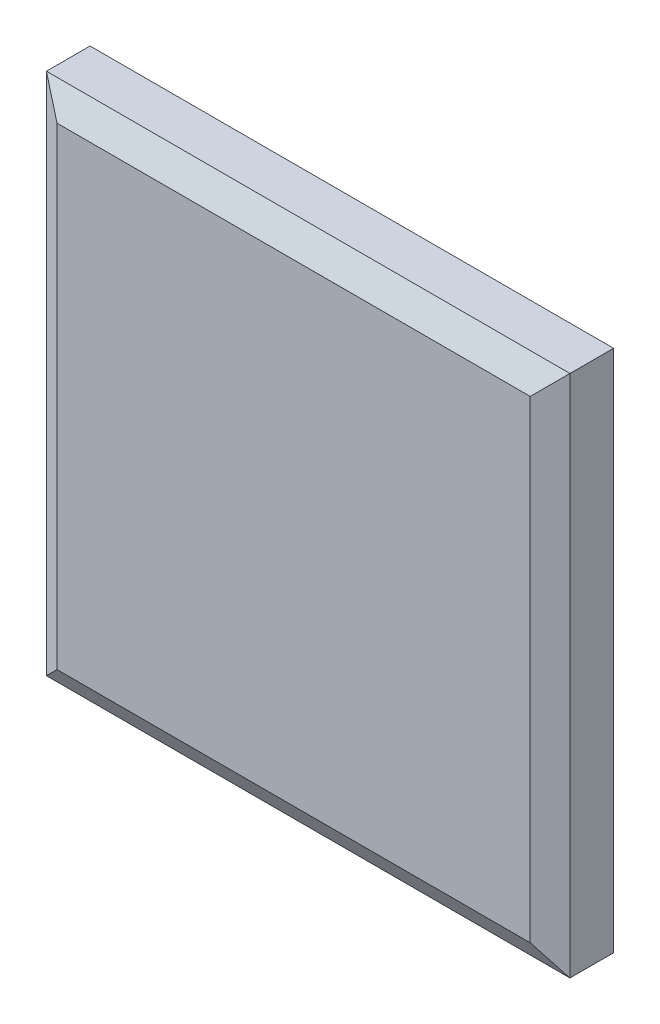
ISO-10303-21;
HEADER;
FILE_DESCRIPTION(('STEP AP214'),'2;1');
FILE_NAME('part.step','',(''),(''),'','','');
FILE_SCHEMA(('AUTOMOTIVE_DESIGN { 1 0 10303 214 1 1 1 1 }'));
ENDSEC;
DATA;
#1=APPLICATION_CONTEXT('core data for automotive mechanical design processes');
#2=APPLICATION_PROTOCOL_DEFINITION('international standard','automotive_design',2000,#1);
#3=PRODUCT_CONTEXT('',#1,'mechanical');
#4=PRODUCT('Part','Part','',(#3));
#5=PRODUCT_RELATED_PRODUCT_CATEGORY('part','',(#4));
#6=PRODUCT_DEFINITION_FORMATION('','',#4);
#7=PRODUCT_DEFINITION_CONTEXT('part definition',#1,'design');
#8=PRODUCT_DEFINITION('design','',#6,#7);
#9=PRODUCT_DEFINITION_SHAPE('','',#8);
#10=(LENGTH_UNIT() NAMED_UNIT(*) SI_UNIT(.MILLI.,.METRE.));
#11=(NAMED_UNIT(*) PLANE_ANGLE_UNIT() SI_UNIT($,.RADIAN.));
#12=(NAMED_UNIT(*) SI_UNIT($,.STERADIAN.) SOLID_ANGLE_UNIT());
#13=UNCERTAINTY_MEASURE_WITH_UNIT(LENGTH_MEASURE(1.E-05),#10,'distance_accuracy_value','');
#14=(GEOMETRIC_REPRESENTATION_CONTEXT(3) GLOBAL_UNCERTAINTY_ASSIGNED_CONTEXT((#13)) GLOBAL_UNIT_ASSIGNED_CONTEXT((#10,
#11,#12)) REPRESENTATION_CONTEXT('',''));
#15=CARTESIAN_POINT('',(0.,0.,0.));
#16=DIRECTION('',(0.,0.,1.));
#17=DIRECTION('',(1.,0.,0.));
#18=AXIS2_PLACEMENT_3D('',#15,#16,#17);
#19=CARTESIAN_POINT('',(0.,-3.,0.));
#20=DIRECTION('',(0.,-0.499999999999999,0.866025403784439));
#21=DIRECTION('',(0.,-0.866025403784439,-0.499999999999999));
#22=AXIS2_PLACEMENT_3D('',#19,#20,#21);
#23=PLANE('',#22);
#24=DIRECTION('',(-1.,0.,0.));
#25=VECTOR('',#24,1.);
#26=CARTESIAN_POINT('',(0.,-3.,0.));
#27=LINE('',#26,#25);
#28=CARTESIAN_POINT('',(18.,-3.,0.));
#29=VERTEX_POINT('',#28);
#30=CARTESIAN_POINT('',(16.,-3.,0.));
#31=VERTEX_POINT('',#30);
#32=EDGE_CURVE('E59',#29,#31,#27,.T.);
#33=ORIENTED_EDGE('',*,*,#32,.F.);
#34=DIRECTION('',(0.654653670707977,-0.654653670707977,-0.377964473009226));
#35=VECTOR('',#34,1.);
#36=CARTESIAN_POINT('',(16.7142857142857,-1.71428571428571,0.74230748895809));
#37=LINE('',#36,#35);
#38=CARTESIAN_POINT('',(16.2679491924311,-1.26794919243112,1.));
#39=VERTEX_POINT('',#38);
#40=EDGE_CURVE('E11',#39,#29,#37,.T.);
#41=ORIENTED_EDGE('',*,*,#40,.F.);
#42=DIRECTION('',(-1.,0.,0.));
#43=VECTOR('',#42,1.);
#44=CARTESIAN_POINT('',(0.,-1.26794919243112,1.));
#45=LINE('',#44,#43);
#46=CARTESIAN_POINT('',(-16.2679491924311,-1.26794919243112,1.));
#47=VERTEX_POINT('',#46);
#48=EDGE_CURVE('E365',#39,#47,#45,.T.);
#49=ORIENTED_EDGE('',*,*,#48,.T.);
#50=DIRECTION('',(-0.654653670707977,-0.654653670707977,-0.377964473009226));
#51=VECTOR('',#50,1.);
#52=CARTESIAN_POINT('',(-10.2857142857143,4.71428571428572,4.45384493374854));
#53=LINE('',#52,#51);
#54=CARTESIAN_POINT('',(-18.,-3.,0.));
#55=VERTEX_POINT('',#54);
#56=EDGE_CURVE('E67',#47,#55,#53,.T.);
#57=ORIENTED_EDGE('',*,*,#56,.T.);
#58=DIRECTION('',(-1.,0.,0.));
#59=VECTOR('',#58,1.);
#60=CARTESIAN_POINT('',(0.,-3.,0.));
#61=LINE('',#60,#59);
#62=CARTESIAN_POINT('',(-16.,-3.,0.));
#63=VERTEX_POINT('',#62);
#64=EDGE_CURVE('E291',#63,#55,#61,.T.);
#65=ORIENTED_EDGE('',*,*,#64,.F.);
#66=EDGE_CURVE('E331',#31,#63,#27,.T.);
#67=ORIENTED_EDGE('',*,*,#66,.F.);
#68=EDGE_LOOP('',(#33,#41,#49,#57,#65,#67));
#69=FACE_BOUND('',#68,.T.);
#70=ADVANCED_FACE('F41',(#69),#23,.T.);
#71=CARTESIAN_POINT('',(18.,0.,0.));
#72=DIRECTION('',(0.499999999999999,0.,0.866025403784439));
#73=DIRECTION('',(0.866025403784439,0.,-0.499999999999999));
#74=AXIS2_PLACEMENT_3D('',#71,#72,#73);
#75=PLANE('',#74);
#76=DIRECTION('',(0.,-1.,0.));
#77=VECTOR('',#76,1.);
#78=CARTESIAN_POINT('',(18.,0.,0.));
#79=LINE('',#78,#77);
#80=CARTESIAN_POINT('',(18.,33.,0.));
#81=VERTEX_POINT('',#80);
#82=EDGE_CURVE('E356',#81,#29,#79,.T.);
#83=ORIENTED_EDGE('',*,*,#82,.F.);
#84=DIRECTION('',(0.654653670707977,0.654653670707977,-0.377964473009227));
#85=VECTOR('',#84,1.);
#86=CARTESIAN_POINT('',(10.2857142857143,25.2857142857143,4.45384493374853));
#87=LINE('',#86,#85);
#88=CARTESIAN_POINT('',(16.2679491924311,31.2679491924311,1.));
#89=VERTEX_POINT('',#88);
#90=EDGE_CURVE('E51',#89,#81,#87,.T.);
#91=ORIENTED_EDGE('',*,*,#90,.F.);
#92=DIRECTION('',(0.,-1.,0.));
#93=VECTOR('',#92,1.);
#94=CARTESIAN_POINT('',(16.2679491924311,0.,1.));
#95=LINE('',#94,#93);
#96=EDGE_CURVE('E378',#89,#39,#95,.T.);
#97=ORIENTED_EDGE('',*,*,#96,.T.);
#98=ORIENTED_EDGE('',*,*,#40,.T.);
#99=EDGE_LOOP('',(#83,#91,#97,#98));
#100=FACE_BOUND('',#99,.T.);
#101=ADVANCED_FACE('F43',(#100),#75,.T.);
#102=CARTESIAN_POINT('',(0.,33.,0.));
#103=DIRECTION('',(0.,0.499999999999999,0.866025403784439));
#104=DIRECTION('',(0.,-0.866025403784439,0.499999999999999));
#105=AXIS2_PLACEMENT_3D('',#102,#103,#104);
#106=PLANE('',#105);
#107=DIRECTION('',(1.,0.,0.));
#108=VECTOR('',#107,1.);
#109=CARTESIAN_POINT('',(0.,33.,0.));
#110=LINE('',#109,#108);
#111=CARTESIAN_POINT('',(-18.,33.,0.));
#112=VERTEX_POINT('',#111);
#113=EDGE_CURVE('E359',#112,#81,#110,.T.);
#114=ORIENTED_EDGE('',*,*,#113,.F.);
#115=DIRECTION('',(-0.654653670707977,0.654653670707977,-0.377964473009226));
#116=VECTOR('',#115,1.);
#117=CARTESIAN_POINT('',(-3.85714285714285,18.8571428571429,8.16538237853898));
#118=LINE('',#117,#116);
#119=CARTESIAN_POINT('',(-16.2679491924311,31.2679491924311,1.));
#120=VERTEX_POINT('',#119);
#121=EDGE_CURVE('E369',#120,#112,#118,.T.);
#122=ORIENTED_EDGE('',*,*,#121,.F.);
#123=DIRECTION('',(1.,0.,0.));
#124=VECTOR('',#123,1.);
#125=CARTESIAN_POINT('',(0.,31.2679491924311,1.));
#126=LINE('',#125,#124);
#127=EDGE_CURVE('E381',#120,#89,#126,.T.);
#128=ORIENTED_EDGE('',*,*,#127,.T.);
#129=ORIENTED_EDGE('',*,*,#90,.T.);
#130=EDGE_LOOP('',(#114,#122,#128,#129));
#131=FACE_BOUND('',#130,.T.);
#132=ADVANCED_FACE('F396',(#131),#106,.T.);
#133=CARTESIAN_POINT('',(-18.,0.,0.));
#134=DIRECTION('',(-0.499999999999999,0.,0.866025403784439));
#135=DIRECTION('',(0.866025403784439,0.,0.499999999999999));
#136=AXIS2_PLACEMENT_3D('',#133,#134,#135);
#137=PLANE('',#136);
#138=DIRECTION('',(0.,1.,0.));
#139=VECTOR('',#138,1.);
#140=CARTESIAN_POINT('',(-18.,0.,0.));
#141=LINE('',#140,#139);
#142=EDGE_CURVE('E362',#55,#112,#141,.T.);
#143=ORIENTED_EDGE('',*,*,#142,.F.);
#144=ORIENTED_EDGE('',*,*,#56,.F.);
#145=DIRECTION('',(0.,1.,0.));
#146=VECTOR('',#145,1.);
#147=CARTESIAN_POINT('',(-16.2679491924311,0.,1.));
#148=LINE('',#147,#146);
#149=EDGE_CURVE('E45',#47,#120,#148,.T.);
#150=ORIENTED_EDGE('',*,*,#149,.T.);
#151=ORIENTED_EDGE('',*,*,#121,.T.);
#152=EDGE_LOOP('',(#143,#144,#150,#151));
#153=FACE_BOUND('',#152,.T.);
#154=ADVANCED_FACE('F388',(#153),#137,.T.);
#155=CARTESIAN_POINT('',(0.,0.,1.));
#156=DIRECTION('',(0.,0.,1.));
#157=DIRECTION('',(1.,0.,0.));
#158=AXIS2_PLACEMENT_3D('',#155,#156,#157);
#159=PLANE('',#158);
#160=ORIENTED_EDGE('',*,*,#48,.F.);
#161=ORIENTED_EDGE('',*,*,#96,.F.);
#162=ORIENTED_EDGE('',*,*,#127,.F.);
#163=ORIENTED_EDGE('',*,*,#149,.F.);
#164=EDGE_LOOP('',(#160,#161,#162,#163));
#165=FACE_BOUND('',#164,.T.);
#166=ADVANCED_FACE('F392',(#165),#159,.T.);
#167=CARTESIAN_POINT('',(0.,0.,0.));
#168=DIRECTION('',(0.,0.,1.));
#169=DIRECTION('',(1.,0.,0.));
#170=AXIS2_PLACEMENT_3D('',#167,#168,#169);
#171=PLANE('',#170);
#172=ORIENTED_EDGE('',*,*,#66,.T.);
#173=DIRECTION('',(0.,1.,0.));
#174=VECTOR('',#173,1.);
#175=CARTESIAN_POINT('',(-16.,0.,0.));
#176=LINE('',#175,#174);
#177=CARTESIAN_POINT('',(-16.,31.,0.));
#178=VERTEX_POINT('',#177);
#179=EDGE_CURVE('E317',#63,#178,#176,.T.);
#180=ORIENTED_EDGE('',*,*,#179,.T.);
#181=DIRECTION('',(1.,0.,0.));
#182=VECTOR('',#181,1.);
#183=CARTESIAN_POINT('',(0.,31.,0.));
#184=LINE('',#183,#182);
#185=CARTESIAN_POINT('',(16.,31.,0.));
#186=VERTEX_POINT('',#185);
#187=EDGE_CURVE('E321',#178,#186,#184,.T.);
#188=ORIENTED_EDGE('',*,*,#187,.T.);
#189=DIRECTION('',(0.,-1.,0.));
#190=VECTOR('',#189,1.);
#191=CARTESIAN_POINT('',(16.,0.,0.));
#192=LINE('',#191,#190);
#193=EDGE_CURVE('E296',#186,#31,#192,.T.);
#194=ORIENTED_EDGE('',*,*,#193,.T.);
#195=EDGE_LOOP('',(#172,#180,#188,#194));
#196=FACE_BOUND('',#195,.T.);
#197=ADVANCED_FACE('F455',(#196),#171,.F.);
#198=CARTESIAN_POINT('',(-18.,0.,-3.));
#199=DIRECTION('',(1.,0.,0.));
#200=DIRECTION('',(0.,0.,-1.));
#201=AXIS2_PLACEMENT_3D('',#198,#199,#200);
#202=PLANE('',#201);
#203=ORIENTED_EDGE('',*,*,#142,.T.);
#204=DIRECTION('',(0.,0.,1.));
#205=VECTOR('',#204,1.);
#206=CARTESIAN_POINT('',(-18.,33.,-3.));
#207=LINE('',#206,#205);
#208=CARTESIAN_POINT('',(-18.,33.,-3.));
#209=VERTEX_POINT('',#208);
#210=EDGE_CURVE('E328',#209,#112,#207,.T.);
#211=ORIENTED_EDGE('',*,*,#210,.F.);
#212=DIRECTION('',(0.,1.,0.));
#213=VECTOR('',#212,1.);
#214=CARTESIAN_POINT('',(-18.,0.,-3.));
#215=LINE('',#214,#213);
#216=CARTESIAN_POINT('',(-18.,-3.,-3.));
#217=VERTEX_POINT('',#216);
#218=EDGE_CURVE('E292',#217,#209,#215,.T.);
#219=ORIENTED_EDGE('',*,*,#218,.F.);
#220=DIRECTION('',(0.,0.,1.));
#221=VECTOR('',#220,1.);
#222=CARTESIAN_POINT('',(-18.,-3.,-3.));
#223=LINE('',#222,#221);
#224=EDGE_CURVE('E314',#217,#55,#223,.T.);
#225=ORIENTED_EDGE('',*,*,#224,.T.);
#226=EDGE_LOOP('',(#203,#211,#219,#225));
#227=FACE_BOUND('',#226,.T.);
#228=ADVANCED_FACE('F453',(#227),#202,.F.);
#229=CARTESIAN_POINT('',(0.,33.,-3.));
#230=DIRECTION('',(0.,-1.,0.));
#231=DIRECTION('',(0.,0.,-1.));
#232=AXIS2_PLACEMENT_3D('',#229,#230,#231);
#233=PLANE('',#232);
#234=ORIENTED_EDGE('',*,*,#113,.T.);
#235=DIRECTION('',(0.,0.,1.));
#236=VECTOR('',#235,1.);
#237=CARTESIAN_POINT('',(18.,33.,-3.));
#238=LINE('',#237,#236);
#239=CARTESIAN_POINT('',(18.,33.,-3.));
#240=VERTEX_POINT('',#239);
#241=EDGE_CURVE('E332',#240,#81,#238,.T.);
#242=ORIENTED_EDGE('',*,*,#241,.F.);
#243=DIRECTION('',(1.,0.,0.));
#244=VECTOR('',#243,1.);
#245=CARTESIAN_POINT('',(0.,33.,-3.));
#246=LINE('',#245,#244);
#247=EDGE_CURVE('E311',#209,#240,#246,.T.);
#248=ORIENTED_EDGE('',*,*,#247,.F.);
#249=ORIENTED_EDGE('',*,*,#210,.T.);
#250=EDGE_LOOP('',(#234,#242,#248,#249));
#251=FACE_BOUND('',#250,.T.);
#252=ADVANCED_FACE('F399',(#251),#233,.F.);
#253=CARTESIAN_POINT('',(18.,0.,-3.));
#254=DIRECTION('',(-1.,0.,0.));
#255=DIRECTION('',(0.,-1.,0.));
#256=AXIS2_PLACEMENT_3D('',#253,#254,#255);
#257=PLANE('',#256);
#258=ORIENTED_EDGE('',*,*,#82,.T.);
#259=DIRECTION('',(0.,0.,1.));
#260=VECTOR('',#259,1.);
#261=CARTESIAN_POINT('',(18.,-3.,-3.));
#262=LINE('',#261,#260);
#263=CARTESIAN_POINT('',(18.,-3.,-3.));
#264=VERTEX_POINT('',#263);
#265=EDGE_CURVE('E336',#264,#29,#262,.T.);
#266=ORIENTED_EDGE('',*,*,#265,.F.);
#267=DIRECTION('',(0.,-1.,0.));
#268=VECTOR('',#267,1.);
#269=CARTESIAN_POINT('',(18.,0.,-3.));
#270=LINE('',#269,#268);
#271=EDGE_CURVE('E308',#240,#264,#270,.T.);
#272=ORIENTED_EDGE('',*,*,#271,.F.);
#273=ORIENTED_EDGE('',*,*,#241,.T.);
#274=EDGE_LOOP('',(#258,#266,#272,#273));
#275=FACE_BOUND('',#274,.T.);
#276=ADVANCED_FACE('F404',(#275),#257,.F.);
#277=CARTESIAN_POINT('',(0.,-3.,-3.));
#278=DIRECTION('',(0.,1.,0.));
#279=DIRECTION('',(-1.,0.,0.));
#280=AXIS2_PLACEMENT_3D('',#277,#278,#279);
#281=PLANE('',#280);
#282=ORIENTED_EDGE('',*,*,#32,.T.);
#283=DIRECTION('',(0.,0.,1.));
#284=VECTOR('',#283,1.);
#285=CARTESIAN_POINT('',(16.,-3.,-3.));
#286=LINE('',#285,#284);
#287=CARTESIAN_POINT('',(16.,-3.,-3.));
#288=VERTEX_POINT('',#287);
#289=EDGE_CURVE('E339',#288,#31,#286,.T.);
#290=ORIENTED_EDGE('',*,*,#289,.F.);
#291=DIRECTION('',(-1.,0.,0.));
#292=VECTOR('',#291,1.);
#293=CARTESIAN_POINT('',(0.,-3.,-3.));
#294=LINE('',#293,#292);
#295=EDGE_CURVE('E300',#264,#288,#294,.T.);
#296=ORIENTED_EDGE('',*,*,#295,.F.);
#297=ORIENTED_EDGE('',*,*,#265,.T.);
#298=EDGE_LOOP('',(#282,#290,#296,#297));
#299=FACE_BOUND('',#298,.T.);
#300=ADVANCED_FACE('F513',(#299),#281,.F.);
#301=CARTESIAN_POINT('',(16.,0.,-3.));
#302=DIRECTION('',(-1.,0.,0.));
#303=DIRECTION('',(0.,0.,1.));
#304=AXIS2_PLACEMENT_3D('',#301,#302,#303);
#305=PLANE('',#304);
#306=ORIENTED_EDGE('',*,*,#193,.F.);
#307=DIRECTION('',(0.,0.,1.));
#308=VECTOR('',#307,1.);
#309=CARTESIAN_POINT('',(16.,31.,-3.));
#310=LINE('',#309,#308);
#311=CARTESIAN_POINT('',(16.,31.,-3.));
#312=VERTEX_POINT('',#311);
#313=EDGE_CURVE('E342',#312,#186,#310,.T.);
#314=ORIENTED_EDGE('',*,*,#313,.F.);
#315=DIRECTION('',(0.,-1.,0.));
#316=VECTOR('',#315,1.);
#317=CARTESIAN_POINT('',(16.,0.,-3.));
#318=LINE('',#317,#316);
#319=CARTESIAN_POINT('',(16.,11.,-3.));
#320=VERTEX_POINT('',#319);
#321=EDGE_CURVE('E185',#312,#320,#318,.T.);
#322=ORIENTED_EDGE('',*,*,#321,.T.);
#323=DIRECTION('',(0.,1.,0.));
#324=VECTOR('',#323,1.);
#325=CARTESIAN_POINT('',(16.,0.,-3.));
#326=LINE('',#325,#324);
#327=CARTESIAN_POINT('',(16.,4.,-3.));
#328=VERTEX_POINT('',#327);
#329=EDGE_CURVE('E195',#328,#320,#326,.T.);
#330=ORIENTED_EDGE('',*,*,#329,.F.);
#331=EDGE_CURVE('E173',#328,#288,#318,.T.);
#332=ORIENTED_EDGE('',*,*,#331,.T.);
#333=ORIENTED_EDGE('',*,*,#289,.T.);
#334=EDGE_LOOP('',(#306,#314,#322,#330,#332,#333));
#335=FACE_BOUND('',#334,.T.);
#336=ADVANCED_FACE('F212',(#335),#305,.T.);
#337=CARTESIAN_POINT('',(0.,31.,-3.));
#338=DIRECTION('',(0.,-1.,0.));
#339=DIRECTION('',(0.,0.,-1.));
#340=AXIS2_PLACEMENT_3D('',#337,#338,#339);
#341=PLANE('',#340);
#342=ORIENTED_EDGE('',*,*,#187,.F.);
#343=DIRECTION('',(0.,0.,1.));
#344=VECTOR('',#343,1.);
#345=CARTESIAN_POINT('',(-16.,31.,-3.));
#346=LINE('',#345,#344);
#347=CARTESIAN_POINT('',(-16.,31.,-3.));
#348=VERTEX_POINT('',#347);
#349=EDGE_CURVE('E345',#348,#178,#346,.T.);
#350=ORIENTED_EDGE('',*,*,#349,.F.);
#351=DIRECTION('',(1.,0.,0.));
#352=VECTOR('',#351,1.);
#353=CARTESIAN_POINT('',(0.,31.,-3.));
#354=LINE('',#353,#352);
#355=EDGE_CURVE('E186',#348,#312,#354,.T.);
#356=ORIENTED_EDGE('',*,*,#355,.T.);
#357=ORIENTED_EDGE('',*,*,#313,.T.);
#358=EDGE_LOOP('',(#342,#350,#356,#357));
#359=FACE_BOUND('',#358,.T.);
#360=ADVANCED_FACE('F530',(#359),#341,.T.);
#361=CARTESIAN_POINT('',(-16.,0.,-3.));
#362=DIRECTION('',(1.,0.,0.));
#363=DIRECTION('',(0.,0.,-1.));
#364=AXIS2_PLACEMENT_3D('',#361,#362,#363);
#365=PLANE('',#364);
#366=ORIENTED_EDGE('',*,*,#179,.F.);
#367=DIRECTION('',(0.,0.,1.));
#368=VECTOR('',#367,1.);
#369=CARTESIAN_POINT('',(-16.,-3.,-3.));
#370=LINE('',#369,#368);
#371=CARTESIAN_POINT('',(-16.,-3.,-3.));
#372=VERTEX_POINT('',#371);
#373=EDGE_CURVE('E348',#372,#63,#370,.T.);
#374=ORIENTED_EDGE('',*,*,#373,.F.);
#375=DIRECTION('',(0.,1.,0.));
#376=VECTOR('',#375,1.);
#377=CARTESIAN_POINT('',(-16.,0.,-3.));
#378=LINE('',#377,#376);
#379=CARTESIAN_POINT('',(-16.,4.,-3.));
#380=VERTEX_POINT('',#379);
#381=EDGE_CURVE('E301',#372,#380,#378,.T.);
#382=ORIENTED_EDGE('',*,*,#381,.T.);
#383=DIRECTION('',(0.,-1.,0.));
#384=VECTOR('',#383,1.);
#385=CARTESIAN_POINT('',(-16.,0.,-3.));
#386=LINE('',#385,#384);
#387=CARTESIAN_POINT('',(-16.,11.,-3.));
#388=VERTEX_POINT('',#387);
#389=EDGE_CURVE('E218',#388,#380,#386,.T.);
#390=ORIENTED_EDGE('',*,*,#389,.F.);
#391=EDGE_CURVE('E299',#388,#348,#378,.T.);
#392=ORIENTED_EDGE('',*,*,#391,.T.);
#393=ORIENTED_EDGE('',*,*,#349,.T.);
#394=EDGE_LOOP('',(#366,#374,#382,#390,#392,#393));
#395=FACE_BOUND('',#394,.T.);
#396=ADVANCED_FACE('F444',(#395),#365,.T.);
#397=ORIENTED_EDGE('',*,*,#64,.T.);
#398=ORIENTED_EDGE('',*,*,#224,.F.);
#399=EDGE_CURVE('E295',#372,#217,#294,.T.);
#400=ORIENTED_EDGE('',*,*,#399,.F.);
#401=ORIENTED_EDGE('',*,*,#373,.T.);
#402=EDGE_LOOP('',(#397,#398,#400,#401));
#403=FACE_BOUND('',#402,.T.);
#404=ADVANCED_FACE('F450',(#403),#281,.F.);
#405=CARTESIAN_POINT('',(0.,0.,-3.));
#406=DIRECTION('',(0.,0.,-1.));
#407=DIRECTION('',(-1.,0.,0.));
#408=AXIS2_PLACEMENT_3D('',#405,#406,#407);
#409=PLANE('',#408);
#410=ORIENTED_EDGE('',*,*,#331,.F.);
#411=DIRECTION('',(1.,0.,0.));
#412=VECTOR('',#411,1.);
#413=CARTESIAN_POINT('',(0.,4.,-3.));
#414=LINE('',#413,#412);
#415=EDGE_CURVE('E177',#380,#328,#414,.T.);
#416=ORIENTED_EDGE('',*,*,#415,.F.);
#417=ORIENTED_EDGE('',*,*,#381,.F.);
#418=DIRECTION('',(-1.,0.,0.));
#419=VECTOR('',#418,1.);
#420=CARTESIAN_POINT('',(0.,-3.,-3.));
#421=LINE('',#420,#419);
#422=EDGE_CURVE('E180',#288,#372,#421,.T.);
#423=ORIENTED_EDGE('',*,*,#422,.F.);
#424=EDGE_LOOP('',(#410,#416,#417,#423));
#425=FACE_BOUND('',#424,.T.);
#426=ADVANCED_FACE('F175',(#425),#409,.F.);
#427=CARTESIAN_POINT('',(0.,0.,-4.));
#428=DIRECTION('',(0.,0.,-1.));
#429=DIRECTION('',(-1.,0.,0.));
#430=AXIS2_PLACEMENT_3D('',#427,#428,#429);
#431=PLANE('',#430);
#432=DIRECTION('',(0.,-1.,0.));
#433=VECTOR('',#432,1.);
#434=CARTESIAN_POINT('',(-16.2679491924311,0.,-4.));
#435=LINE('',#434,#433);
#436=CARTESIAN_POINT('',(-16.2679491924311,-1.26794919243112,-4.));
#437=VERTEX_POINT('',#436);
#438=CARTESIAN_POINT('',(-16.2679491924311,2.26794919243112,-4.));
#439=VERTEX_POINT('',#438);
#440=EDGE_CURVE('E263',#437,#439,#435,.F.);
#441=ORIENTED_EDGE('',*,*,#440,.T.);
#442=DIRECTION('',(-1.,0.,0.));
#443=VECTOR('',#442,1.);
#444=CARTESIAN_POINT('',(0.,2.26794919243112,-4.));
#445=LINE('',#444,#443);
#446=CARTESIAN_POINT('',(16.2679491924311,2.26794919243112,-4.));
#447=VERTEX_POINT('',#446);
#448=EDGE_CURVE('E224',#439,#447,#445,.F.);
#449=ORIENTED_EDGE('',*,*,#448,.T.);
#450=DIRECTION('',(0.,1.,0.));
#451=VECTOR('',#450,1.);
#452=CARTESIAN_POINT('',(16.2679491924311,0.,-4.));
#453=LINE('',#452,#451);
#454=CARTESIAN_POINT('',(16.2679491924311,-1.26794919243112,-4.));
#455=VERTEX_POINT('',#454);
#456=EDGE_CURVE('E270',#447,#455,#453,.F.);
#457=ORIENTED_EDGE('',*,*,#456,.T.);
#458=DIRECTION('',(1.,0.,0.));
#459=VECTOR('',#458,1.);
#460=CARTESIAN_POINT('',(0.,-1.26794919243112,-4.));
#461=LINE('',#460,#459);
#462=EDGE_CURVE('E242',#455,#437,#461,.F.);
#463=ORIENTED_EDGE('',*,*,#462,.T.);
#464=EDGE_LOOP('',(#441,#449,#457,#463));
#465=FACE_BOUND('',#464,.T.);
#466=ADVANCED_FACE('F418',(#465),#431,.T.);
#467=CARTESIAN_POINT('',(0.,-3.,-3.));
#468=DIRECTION('',(0.,-0.499999999999999,-0.866025403784439));
#469=DIRECTION('',(0.,0.866025403784439,-0.499999999999999));
#470=AXIS2_PLACEMENT_3D('',#467,#468,#469);
#471=PLANE('',#470);
#472=ORIENTED_EDGE('',*,*,#295,.T.);
#473=ORIENTED_EDGE('',*,*,#422,.T.);
#474=ORIENTED_EDGE('',*,*,#399,.T.);
#475=DIRECTION('',(-0.654653670707977,-0.654653670707977,0.377964473009226));
#476=VECTOR('',#475,1.);
#477=CARTESIAN_POINT('',(-16.7142857142857,-1.71428571428572,-3.74230748895809));
#478=LINE('',#477,#476);
#479=EDGE_CURVE('E243',#437,#217,#478,.T.);
#480=ORIENTED_EDGE('',*,*,#479,.F.);
#481=ORIENTED_EDGE('',*,*,#462,.F.);
#482=DIRECTION('',(0.654653670707977,-0.654653670707977,0.377964473009226));
#483=VECTOR('',#482,1.);
#484=CARTESIAN_POINT('',(10.2857142857143,4.71428571428572,-7.45384493374853));
#485=LINE('',#484,#483);
#486=EDGE_CURVE('E201',#455,#264,#485,.T.);
#487=ORIENTED_EDGE('',*,*,#486,.T.);
#488=EDGE_LOOP('',(#472,#473,#474,#480,#481,#487));
#489=FACE_BOUND('',#488,.T.);
#490=ADVANCED_FACE('F415',(#489),#471,.T.);
#491=CARTESIAN_POINT('',(-18.,0.,-3.));
#492=DIRECTION('',(-0.499999999999999,0.,-0.866025403784439));
#493=DIRECTION('',(-0.866025403784439,0.,0.499999999999999));
#494=AXIS2_PLACEMENT_3D('',#491,#492,#493);
#495=PLANE('',#494);
#496=DIRECTION('',(-0.654653670707977,-0.654653670707977,0.377964473009226));
#497=VECTOR('',#496,1.);
#498=CARTESIAN_POINT('',(-22.7142857142857,6.28571428571428,-0.278205873820339));
#499=LINE('',#498,#497);
#500=CARTESIAN_POINT('',(-17.,12.,-3.57735026918963));
#501=VERTEX_POINT('',#500);
#502=CARTESIAN_POINT('',(-16.2679491924311,12.7320508075689,-4.));
#503=VERTEX_POINT('',#502);
#504=EDGE_CURVE('E279',#501,#503,#499,.F.);
#505=ORIENTED_EDGE('',*,*,#504,.F.);
#506=DIRECTION('',(0.,-1.,0.));
#507=VECTOR('',#506,1.);
#508=CARTESIAN_POINT('',(-17.,0.,-3.57735026918962));
#509=LINE('',#508,#507);
#510=CARTESIAN_POINT('',(-17.,3.,-3.57735026918963));
#511=VERTEX_POINT('',#510);
#512=EDGE_CURVE('E285',#501,#511,#509,.T.);
#513=ORIENTED_EDGE('',*,*,#512,.T.);
#514=DIRECTION('',(-0.654653670707977,0.654653670707977,0.377964473009226));
#515=VECTOR('',#514,1.);
#516=CARTESIAN_POINT('',(-10.2857142857143,-3.71428571428572,-7.45384493374854));
#517=LINE('',#516,#515);
#518=EDGE_CURVE('E247',#439,#511,#517,.T.);
#519=ORIENTED_EDGE('',*,*,#518,.F.);
#520=ORIENTED_EDGE('',*,*,#440,.F.);
#521=ORIENTED_EDGE('',*,*,#479,.T.);
#522=ORIENTED_EDGE('',*,*,#218,.T.);
#523=DIRECTION('',(-0.654653670707977,0.654653670707977,0.377964473009226));
#524=VECTOR('',#523,1.);
#525=CARTESIAN_POINT('',(-10.2857142857143,25.2857142857143,-7.45384493374854));
#526=LINE('',#525,#524);
#527=CARTESIAN_POINT('',(-16.2679491924311,31.2679491924311,-4.));
#528=VERTEX_POINT('',#527);
#529=EDGE_CURVE('E248',#528,#209,#526,.T.);
#530=ORIENTED_EDGE('',*,*,#529,.F.);
#531=EDGE_CURVE('E262',#503,#528,#435,.F.);
#532=ORIENTED_EDGE('',*,*,#531,.F.);
#533=EDGE_LOOP('',(#505,#513,#519,#520,#521,#522,#530,#532));
#534=FACE_BOUND('',#533,.T.);
#535=ADVANCED_FACE('F429',(#534),#495,.T.);
#536=CARTESIAN_POINT('',(0.,33.,-3.));
#537=DIRECTION('',(0.,0.499999999999999,-0.866025403784439));
#538=DIRECTION('',(0.,0.866025403784439,0.499999999999999));
#539=AXIS2_PLACEMENT_3D('',#536,#537,#538);
#540=PLANE('',#539);
#541=ORIENTED_EDGE('',*,*,#247,.T.);
#542=DIRECTION('',(0.654653670707977,0.654653670707977,0.377964473009227));
#543=VECTOR('',#542,1.);
#544=CARTESIAN_POINT('',(3.85714285714285,18.8571428571429,-11.165382378539));
#545=LINE('',#544,#543);
#546=CARTESIAN_POINT('',(16.2679491924311,31.2679491924311,-4.));
#547=VERTEX_POINT('',#546);
#548=EDGE_CURVE('E252',#547,#240,#545,.T.);
#549=ORIENTED_EDGE('',*,*,#548,.F.);
#550=DIRECTION('',(-1.,0.,0.));
#551=VECTOR('',#550,1.);
#552=CARTESIAN_POINT('',(0.,31.2679491924311,-4.));
#553=LINE('',#552,#551);
#554=EDGE_CURVE('E267',#528,#547,#553,.F.);
#555=ORIENTED_EDGE('',*,*,#554,.F.);
#556=ORIENTED_EDGE('',*,*,#529,.T.);
#557=EDGE_LOOP('',(#541,#549,#555,#556));
#558=FACE_BOUND('',#557,.T.);
#559=ADVANCED_FACE('F432',(#558),#540,.T.);
#560=CARTESIAN_POINT('',(0.,4.,-3.));
#561=DIRECTION('',(0.,0.499999999999999,-0.866025403784439));
#562=DIRECTION('',(0.,0.866025403784439,0.499999999999999));
#563=AXIS2_PLACEMENT_3D('',#560,#561,#562);
#564=PLANE('',#563);
#565=DIRECTION('',(0.654653670707977,0.654653670707977,0.377964473009227));
#566=VECTOR('',#565,1.);
#567=CARTESIAN_POINT('',(16.2857142857143,2.28571428571428,-3.98974331861078));
#568=LINE('',#567,#566);
#569=CARTESIAN_POINT('',(17.,3.,-3.57735026918962));
#570=VERTEX_POINT('',#569);
#571=EDGE_CURVE('E276',#447,#570,#568,.T.);
#572=ORIENTED_EDGE('',*,*,#571,.F.);
#573=ORIENTED_EDGE('',*,*,#448,.F.);
#574=ORIENTED_EDGE('',*,*,#518,.T.);
#575=DIRECTION('',(0.654653670707977,0.654653670707977,0.377964473009227));
#576=VECTOR('',#575,1.);
#577=CARTESIAN_POINT('',(-17.7142857142857,2.28571428571429,-3.98974331861079));
#578=LINE('',#577,#576);
#579=EDGE_CURVE('E206',#511,#380,#578,.T.);
#580=ORIENTED_EDGE('',*,*,#579,.T.);
#581=ORIENTED_EDGE('',*,*,#415,.T.);
#582=DIRECTION('',(-0.654653670707977,0.654653670707977,0.377964473009226));
#583=VECTOR('',#582,1.);
#584=CARTESIAN_POINT('',(9.14285714285714,10.8571428571429,0.958973274443143));
#585=LINE('',#584,#583);
#586=EDGE_CURVE('E192',#570,#328,#585,.T.);
#587=ORIENTED_EDGE('',*,*,#586,.F.);
#588=EDGE_LOOP('',(#572,#573,#574,#580,#581,#587));
#589=FACE_BOUND('',#588,.T.);
#590=ADVANCED_FACE('F204',(#589),#564,.T.);
#591=CARTESIAN_POINT('',(16.,0.,-3.));
#592=DIRECTION('',(-0.499999999999999,0.,-0.866025403784439));
#593=DIRECTION('',(-0.866025403784439,0.,0.499999999999999));
#594=AXIS2_PLACEMENT_3D('',#591,#592,#593);
#595=PLANE('',#594);
#596=DIRECTION('',(0.,1.,0.));
#597=VECTOR('',#596,1.);
#598=CARTESIAN_POINT('',(17.,0.,-3.57735026918962));
#599=LINE('',#598,#597);
#600=CARTESIAN_POINT('',(17.,12.,-3.57735026918962));
#601=VERTEX_POINT('',#600);
#602=EDGE_CURVE('E198',#570,#601,#599,.T.);
#603=ORIENTED_EDGE('',*,*,#602,.F.);
#604=ORIENTED_EDGE('',*,*,#586,.T.);
#605=ORIENTED_EDGE('',*,*,#329,.T.);
#606=DIRECTION('',(0.654653670707977,0.654653670707977,-0.377964473009226));
#607=VECTOR('',#606,1.);
#608=CARTESIAN_POINT('',(9.14285714285714,4.14285714285714,0.958973274443142));
#609=LINE('',#608,#607);
#610=EDGE_CURVE('E202',#601,#320,#609,.F.);
#611=ORIENTED_EDGE('',*,*,#610,.F.);
#612=EDGE_LOOP('',(#603,#604,#605,#611));
#613=FACE_BOUND('',#612,.T.);
#614=ADVANCED_FACE('F193',(#613),#595,.T.);
#615=CARTESIAN_POINT('',(0.,11.,-3.));
#616=DIRECTION('',(0.,-0.499999999999999,-0.866025403784439));
#617=DIRECTION('',(0.,0.866025403784439,-0.499999999999999));
#618=AXIS2_PLACEMENT_3D('',#615,#616,#617);
#619=PLANE('',#618);
#620=DIRECTION('',(0.654653670707977,-0.654653670707977,0.377964473009226));
#621=VECTOR('',#620,1.);
#622=CARTESIAN_POINT('',(10.2857142857143,18.7142857142857,-7.45384493374853));
#623=LINE('',#622,#621);
#624=CARTESIAN_POINT('',(16.2679491924311,12.7320508075689,-4.));
#625=VERTEX_POINT('',#624);
#626=EDGE_CURVE('E282',#601,#625,#623,.F.);
#627=ORIENTED_EDGE('',*,*,#626,.F.);
#628=ORIENTED_EDGE('',*,*,#610,.T.);
#629=DIRECTION('',(1.,0.,0.));
#630=VECTOR('',#629,1.);
#631=CARTESIAN_POINT('',(0.,11.,-3.));
#632=LINE('',#631,#630);
#633=EDGE_CURVE('E215',#388,#320,#632,.T.);
#634=ORIENTED_EDGE('',*,*,#633,.F.);
#635=DIRECTION('',(-0.654653670707977,0.654653670707977,-0.377964473009226));
#636=VECTOR('',#635,1.);
#637=CARTESIAN_POINT('',(-11.2857142857143,6.28571428571428,-0.278205873820339));
#638=LINE('',#637,#636);
#639=EDGE_CURVE('E228',#501,#388,#638,.F.);
#640=ORIENTED_EDGE('',*,*,#639,.F.);
#641=ORIENTED_EDGE('',*,*,#504,.T.);
#642=DIRECTION('',(1.,0.,0.));
#643=VECTOR('',#642,1.);
#644=CARTESIAN_POINT('',(0.,12.7320508075689,-4.));
#645=LINE('',#644,#643);
#646=EDGE_CURVE('E238',#503,#625,#645,.T.);
#647=ORIENTED_EDGE('',*,*,#646,.T.);
#648=EDGE_LOOP('',(#627,#628,#634,#640,#641,#647));
#649=FACE_BOUND('',#648,.T.);
#650=ADVANCED_FACE('F434',(#649),#619,.T.);
#651=CARTESIAN_POINT('',(-16.,0.,-3.));
#652=DIRECTION('',(0.499999999999999,0.,-0.866025403784439));
#653=DIRECTION('',(-0.866025403784439,0.,-0.499999999999999));
#654=AXIS2_PLACEMENT_3D('',#651,#652,#653);
#655=PLANE('',#654);
#656=ORIENTED_EDGE('',*,*,#512,.F.);
#657=ORIENTED_EDGE('',*,*,#639,.T.);
#658=ORIENTED_EDGE('',*,*,#389,.T.);
#659=ORIENTED_EDGE('',*,*,#579,.F.);
#660=EDGE_LOOP('',(#656,#657,#658,#659));
#661=FACE_BOUND('',#660,.T.);
#662=ADVANCED_FACE('F439',(#661),#655,.T.);
#663=CARTESIAN_POINT('',(18.,0.,-3.));
#664=DIRECTION('',(0.499999999999999,0.,-0.866025403784439));
#665=DIRECTION('',(-0.866025403784439,0.,-0.499999999999999));
#666=AXIS2_PLACEMENT_3D('',#663,#664,#665);
#667=PLANE('',#666);
#668=ORIENTED_EDGE('',*,*,#571,.T.);
#669=ORIENTED_EDGE('',*,*,#602,.T.);
#670=ORIENTED_EDGE('',*,*,#626,.T.);
#671=EDGE_CURVE('E229',#547,#625,#453,.F.);
#672=ORIENTED_EDGE('',*,*,#671,.F.);
#673=ORIENTED_EDGE('',*,*,#548,.T.);
#674=ORIENTED_EDGE('',*,*,#271,.T.);
#675=ORIENTED_EDGE('',*,*,#486,.F.);
#676=ORIENTED_EDGE('',*,*,#456,.F.);
#677=EDGE_LOOP('',(#668,#669,#670,#672,#673,#674,#675,#676));
#678=FACE_BOUND('',#677,.T.);
#679=ADVANCED_FACE('F409',(#678),#667,.T.);
#680=ORIENTED_EDGE('',*,*,#646,.F.);
#681=ORIENTED_EDGE('',*,*,#531,.T.);
#682=ORIENTED_EDGE('',*,*,#554,.T.);
#683=ORIENTED_EDGE('',*,*,#671,.T.);
#684=EDGE_LOOP('',(#680,#681,#682,#683));
#685=FACE_BOUND('',#684,.T.);
#686=ADVANCED_FACE('F426',(#685),#431,.T.);
#687=ORIENTED_EDGE('',*,*,#321,.F.);
#688=ORIENTED_EDGE('',*,*,#355,.F.);
#689=ORIENTED_EDGE('',*,*,#391,.F.);
#690=ORIENTED_EDGE('',*,*,#633,.T.);
#691=EDGE_LOOP('',(#687,#688,#689,#690));
#692=FACE_BOUND('',#691,.T.);
#693=ADVANCED_FACE('F565',(#692),#409,.F.);
#694=CLOSED_SHELL('',(#70,#101,#132,#154,#166,#197,#228,#252,#276,#300,#336,#360,#396,#404,#426,
#466,#490,#535,#559,#590,#614,#650,#662,#679,#686,#693));
#695=MANIFOLD_SOLID_BREP('B2',#694);
#696=ADVANCED_BREP_SHAPE_REPRESENTATION('',(#18,#695),#14);
#697=SHAPE_DEFINITION_REPRESENTATION(#9,#696);
ENDSEC;
END-ISO-10303-21;
